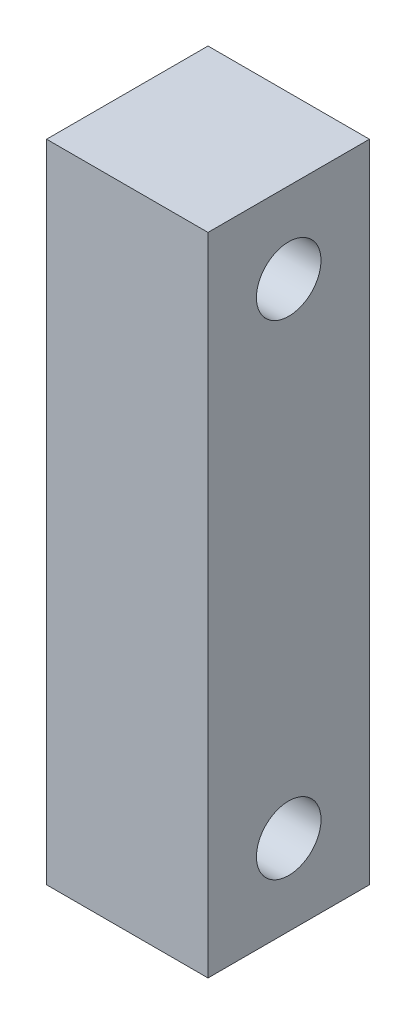
ISO-10303-21;
HEADER;
FILE_DESCRIPTION(('STEP AP214'),'2;1');
FILE_NAME('part.step','',(''),(''),'','','');
FILE_SCHEMA(('AUTOMOTIVE_DESIGN { 1 0 10303 214 1 1 1 1 }'));
ENDSEC;
DATA;
#1=APPLICATION_CONTEXT('core data for automotive mechanical design processes');
#2=APPLICATION_PROTOCOL_DEFINITION('international standard','automotive_design',2000,#1);
#3=PRODUCT_CONTEXT('',#1,'mechanical');
#4=PRODUCT('Part','Part','',(#3));
#5=PRODUCT_RELATED_PRODUCT_CATEGORY('part','',(#4));
#6=PRODUCT_DEFINITION_FORMATION('','',#4);
#7=PRODUCT_DEFINITION_CONTEXT('part definition',#1,'design');
#8=PRODUCT_DEFINITION('design','',#6,#7);
#9=PRODUCT_DEFINITION_SHAPE('','',#8);
#10=(LENGTH_UNIT() NAMED_UNIT(*) SI_UNIT(.MILLI.,.METRE.));
#11=(NAMED_UNIT(*) PLANE_ANGLE_UNIT() SI_UNIT($,.RADIAN.));
#12=(NAMED_UNIT(*) SI_UNIT($,.STERADIAN.) SOLID_ANGLE_UNIT());
#13=UNCERTAINTY_MEASURE_WITH_UNIT(LENGTH_MEASURE(1.E-05),#10,'distance_accuracy_value','');
#14=(GEOMETRIC_REPRESENTATION_CONTEXT(3) GLOBAL_UNCERTAINTY_ASSIGNED_CONTEXT((#13)) GLOBAL_UNIT_ASSIGNED_CONTEXT((#10,
#11,#12)) REPRESENTATION_CONTEXT('',''));
#15=CARTESIAN_POINT('',(0.,0.,0.));
#16=DIRECTION('',(0.,0.,1.));
#17=DIRECTION('',(1.,0.,0.));
#18=AXIS2_PLACEMENT_3D('',#15,#16,#17);
#19=CARTESIAN_POINT('',(10.,0.,10.));
#20=DIRECTION('',(-1.,0.,0.));
#21=DIRECTION('',(0.,0.,1.));
#22=AXIS2_PLACEMENT_3D('',#19,#20,#21);
#23=PLANE('',#22);
#24=CARTESIAN_POINT('',(10.,5.,5.));
#25=DIRECTION('',(-1.,0.,0.));
#26=DIRECTION('',(0.,0.,-1.));
#27=AXIS2_PLACEMENT_3D('',#24,#25,#26);
#28=CIRCLE('',#27,2.);
#29=CARTESIAN_POINT('',(10.,5.,3.));
#30=VERTEX_POINT('',#29);
#31=EDGE_CURVE('E113',#30,#30,#28,.T.);
#32=ORIENTED_EDGE('',*,*,#31,.T.);
#33=EDGE_LOOP('',(#32));
#34=FACE_BOUND('',#33,.T.);
#35=CARTESIAN_POINT('',(10.,35.,5.));
#36=DIRECTION('',(-1.,0.,0.));
#37=DIRECTION('',(0.,0.,1.));
#38=AXIS2_PLACEMENT_3D('',#35,#36,#37);
#39=CIRCLE('',#38,2.);
#40=CARTESIAN_POINT('',(10.,35.,7.));
#41=VERTEX_POINT('',#40);
#42=EDGE_CURVE('E99',#41,#41,#39,.T.);
#43=ORIENTED_EDGE('',*,*,#42,.T.);
#44=EDGE_LOOP('',(#43));
#45=FACE_BOUND('',#44,.T.);
#46=DIRECTION('',(0.,1.,0.));
#47=VECTOR('',#46,1.);
#48=CARTESIAN_POINT('',(10.,0.,0.));
#49=LINE('',#48,#47);
#50=CARTESIAN_POINT('',(10.,0.,0.));
#51=VERTEX_POINT('',#50);
#52=CARTESIAN_POINT('',(10.,40.,0.));
#53=VERTEX_POINT('',#52);
#54=EDGE_CURVE('E96',#51,#53,#49,.T.);
#55=ORIENTED_EDGE('',*,*,#54,.T.);
#56=DIRECTION('',(0.,0.,-1.));
#57=VECTOR('',#56,1.);
#58=CARTESIAN_POINT('',(10.,40.,10.));
#59=LINE('',#58,#57);
#60=CARTESIAN_POINT('',(10.,40.,10.));
#61=VERTEX_POINT('',#60);
#62=EDGE_CURVE('E11',#61,#53,#59,.T.);
#63=ORIENTED_EDGE('',*,*,#62,.F.);
#64=DIRECTION('',(0.,1.,0.));
#65=VECTOR('',#64,1.);
#66=CARTESIAN_POINT('',(10.,0.,10.));
#67=LINE('',#66,#65);
#68=CARTESIAN_POINT('',(10.,0.,10.));
#69=VERTEX_POINT('',#68);
#70=EDGE_CURVE('E84',#69,#61,#67,.T.);
#71=ORIENTED_EDGE('',*,*,#70,.F.);
#72=DIRECTION('',(0.,0.,-1.));
#73=VECTOR('',#72,1.);
#74=CARTESIAN_POINT('',(10.,0.,10.));
#75=LINE('',#74,#73);
#76=EDGE_CURVE('E92',#69,#51,#75,.T.);
#77=ORIENTED_EDGE('',*,*,#76,.T.);
#78=EDGE_LOOP('',(#55,#63,#71,#77));
#79=FACE_BOUND('',#78,.T.);
#80=ADVANCED_FACE('F33',(#34,#45,#79),#23,.F.);
#81=CARTESIAN_POINT('',(0.,40.,10.));
#82=DIRECTION('',(0.,-1.,0.));
#83=DIRECTION('',(0.,0.,-1.));
#84=AXIS2_PLACEMENT_3D('',#81,#82,#83);
#85=PLANE('',#84);
#86=DIRECTION('',(-1.,0.,0.));
#87=VECTOR('',#86,1.);
#88=CARTESIAN_POINT('',(0.,40.,0.));
#89=LINE('',#88,#87);
#90=CARTESIAN_POINT('',(0.,40.,0.));
#91=VERTEX_POINT('',#90);
#92=EDGE_CURVE('E88',#53,#91,#89,.T.);
#93=ORIENTED_EDGE('',*,*,#92,.T.);
#94=DIRECTION('',(0.,0.,-1.));
#95=VECTOR('',#94,1.);
#96=CARTESIAN_POINT('',(0.,40.,10.));
#97=LINE('',#96,#95);
#98=CARTESIAN_POINT('',(0.,40.,10.));
#99=VERTEX_POINT('',#98);
#100=EDGE_CURVE('E41',#99,#91,#97,.T.);
#101=ORIENTED_EDGE('',*,*,#100,.F.);
#102=DIRECTION('',(-1.,0.,0.));
#103=VECTOR('',#102,1.);
#104=CARTESIAN_POINT('',(0.,40.,10.));
#105=LINE('',#104,#103);
#106=EDGE_CURVE('E79',#61,#99,#105,.T.);
#107=ORIENTED_EDGE('',*,*,#106,.F.);
#108=ORIENTED_EDGE('',*,*,#62,.T.);
#109=EDGE_LOOP('',(#93,#101,#107,#108));
#110=FACE_BOUND('',#109,.T.);
#111=ADVANCED_FACE('F87',(#110),#85,.F.);
#112=CARTESIAN_POINT('',(0.,0.,10.));
#113=DIRECTION('',(1.,0.,0.));
#114=DIRECTION('',(0.,0.,-1.));
#115=AXIS2_PLACEMENT_3D('',#112,#113,#114);
#116=PLANE('',#115);
#117=CARTESIAN_POINT('',(0.,5.,5.));
#118=DIRECTION('',(-1.,0.,0.));
#119=DIRECTION('',(0.,0.,-1.));
#120=AXIS2_PLACEMENT_3D('',#117,#118,#119);
#121=CIRCLE('',#120,2.);
#122=CARTESIAN_POINT('',(0.,5.,3.));
#123=VERTEX_POINT('',#122);
#124=EDGE_CURVE('E116',#123,#123,#121,.T.);
#125=ORIENTED_EDGE('',*,*,#124,.F.);
#126=EDGE_LOOP('',(#125));
#127=FACE_BOUND('',#126,.T.);
#128=CARTESIAN_POINT('',(0.,35.,5.));
#129=DIRECTION('',(-1.,0.,0.));
#130=DIRECTION('',(0.,0.,1.));
#131=AXIS2_PLACEMENT_3D('',#128,#129,#130);
#132=CIRCLE('',#131,2.);
#133=CARTESIAN_POINT('',(0.,35.,7.));
#134=VERTEX_POINT('',#133);
#135=EDGE_CURVE('E110',#134,#134,#132,.T.);
#136=ORIENTED_EDGE('',*,*,#135,.F.);
#137=EDGE_LOOP('',(#136));
#138=FACE_BOUND('',#137,.T.);
#139=DIRECTION('',(0.,-1.,0.));
#140=VECTOR('',#139,1.);
#141=CARTESIAN_POINT('',(0.,0.,0.));
#142=LINE('',#141,#140);
#143=CARTESIAN_POINT('',(0.,0.,0.));
#144=VERTEX_POINT('',#143);
#145=EDGE_CURVE('E66',#91,#144,#142,.T.);
#146=ORIENTED_EDGE('',*,*,#145,.T.);
#147=DIRECTION('',(0.,0.,-1.));
#148=VECTOR('',#147,1.);
#149=CARTESIAN_POINT('',(0.,0.,10.));
#150=LINE('',#149,#148);
#151=CARTESIAN_POINT('',(0.,0.,10.));
#152=VERTEX_POINT('',#151);
#153=EDGE_CURVE('E89',#152,#144,#150,.T.);
#154=ORIENTED_EDGE('',*,*,#153,.F.);
#155=DIRECTION('',(0.,-1.,0.));
#156=VECTOR('',#155,1.);
#157=CARTESIAN_POINT('',(0.,0.,10.));
#158=LINE('',#157,#156);
#159=EDGE_CURVE('E82',#99,#152,#158,.T.);
#160=ORIENTED_EDGE('',*,*,#159,.F.);
#161=ORIENTED_EDGE('',*,*,#100,.T.);
#162=EDGE_LOOP('',(#146,#154,#160,#161));
#163=FACE_BOUND('',#162,.T.);
#164=ADVANCED_FACE('F90',(#127,#138,#163),#116,.F.);
#165=CARTESIAN_POINT('',(0.,0.,10.));
#166=DIRECTION('',(0.,1.,0.));
#167=DIRECTION('',(0.,0.,1.));
#168=AXIS2_PLACEMENT_3D('',#165,#166,#167);
#169=PLANE('',#168);
#170=DIRECTION('',(1.,0.,0.));
#171=VECTOR('',#170,1.);
#172=CARTESIAN_POINT('',(0.,0.,0.));
#173=LINE('',#172,#171);
#174=EDGE_CURVE('E72',#144,#51,#173,.T.);
#175=ORIENTED_EDGE('',*,*,#174,.T.);
#176=ORIENTED_EDGE('',*,*,#76,.F.);
#177=DIRECTION('',(1.,0.,0.));
#178=VECTOR('',#177,1.);
#179=CARTESIAN_POINT('',(0.,0.,10.));
#180=LINE('',#179,#178);
#181=EDGE_CURVE('E49',#152,#69,#180,.T.);
#182=ORIENTED_EDGE('',*,*,#181,.F.);
#183=ORIENTED_EDGE('',*,*,#153,.T.);
#184=EDGE_LOOP('',(#175,#176,#182,#183));
#185=FACE_BOUND('',#184,.T.);
#186=ADVANCED_FACE('F104',(#185),#169,.F.);
#187=CARTESIAN_POINT('',(10.,40.,10.));
#188=DIRECTION('',(0.,0.,-1.));
#189=DIRECTION('',(-1.,0.,0.));
#190=AXIS2_PLACEMENT_3D('',#187,#188,#189);
#191=PLANE('',#190);
#192=ORIENTED_EDGE('',*,*,#70,.T.);
#193=ORIENTED_EDGE('',*,*,#106,.T.);
#194=ORIENTED_EDGE('',*,*,#159,.T.);
#195=ORIENTED_EDGE('',*,*,#181,.T.);
#196=EDGE_LOOP('',(#192,#193,#194,#195));
#197=FACE_BOUND('',#196,.T.);
#198=ADVANCED_FACE('F80',(#197),#191,.F.);
#199=CARTESIAN_POINT('',(10.,40.,0.));
#200=DIRECTION('',(0.,0.,-1.));
#201=DIRECTION('',(-1.,0.,0.));
#202=AXIS2_PLACEMENT_3D('',#199,#200,#201);
#203=PLANE('',#202);
#204=ORIENTED_EDGE('',*,*,#54,.F.);
#205=ORIENTED_EDGE('',*,*,#174,.F.);
#206=ORIENTED_EDGE('',*,*,#145,.F.);
#207=ORIENTED_EDGE('',*,*,#92,.F.);
#208=EDGE_LOOP('',(#204,#205,#206,#207));
#209=FACE_BOUND('',#208,.T.);
#210=ADVANCED_FACE('F107',(#209),#203,.T.);
#211=CARTESIAN_POINT('',(10.,35.,5.));
#212=DIRECTION('',(-1.,0.,0.));
#213=DIRECTION('',(0.,0.,1.));
#214=AXIS2_PLACEMENT_3D('',#211,#212,#213);
#215=CYLINDRICAL_SURFACE('',#214,2.);
#216=ORIENTED_EDGE('',*,*,#42,.F.);
#217=EDGE_LOOP('',(#216));
#218=FACE_BOUND('',#217,.T.);
#219=ORIENTED_EDGE('',*,*,#135,.T.);
#220=EDGE_LOOP('',(#219));
#221=FACE_BOUND('',#220,.T.);
#222=ADVANCED_FACE('F127',(#218,#221),#215,.F.);
#223=CARTESIAN_POINT('',(10.,5.,5.));
#224=DIRECTION('',(-1.,0.,0.));
#225=DIRECTION('',(0.,0.,1.));
#226=AXIS2_PLACEMENT_3D('',#223,#224,#225);
#227=CYLINDRICAL_SURFACE('',#226,2.);
#228=ORIENTED_EDGE('',*,*,#31,.F.);
#229=EDGE_LOOP('',(#228));
#230=FACE_BOUND('',#229,.T.);
#231=ORIENTED_EDGE('',*,*,#124,.T.);
#232=EDGE_LOOP('',(#231));
#233=FACE_BOUND('',#232,.T.);
#234=ADVANCED_FACE('F124',(#230,#233),#227,.F.);
#235=CLOSED_SHELL('',(#80,#111,#164,#186,#198,#210,#222,#234));
#236=MANIFOLD_SOLID_BREP('B2',#235);
#237=ADVANCED_BREP_SHAPE_REPRESENTATION('',(#18,#236),#14);
#238=SHAPE_DEFINITION_REPRESENTATION(#9,#237);
ENDSEC;
END-ISO-10303-21;
